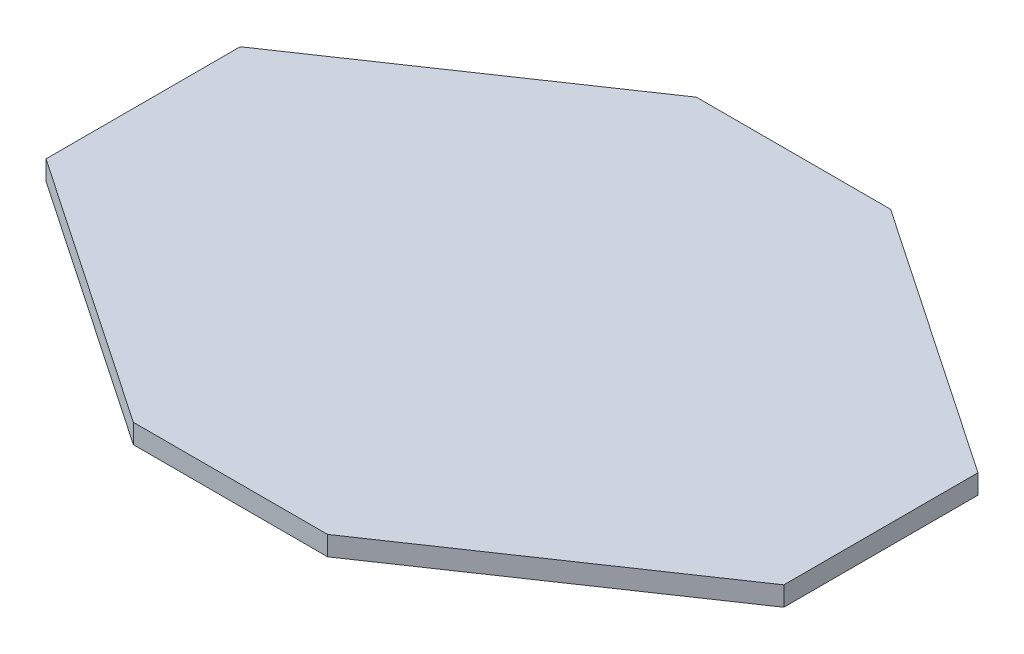
ISO-10303-21;
HEADER;
FILE_DESCRIPTION(('STEP AP214'),'2;1');
FILE_NAME('part.step','',(''),(''),'','','');
FILE_SCHEMA(('AUTOMOTIVE_DESIGN { 1 0 10303 214 1 1 1 1 }'));
ENDSEC;
DATA;
#1=APPLICATION_CONTEXT('core data for automotive mechanical design processes');
#2=APPLICATION_PROTOCOL_DEFINITION('international standard','automotive_design',2000,#1);
#3=PRODUCT_CONTEXT('',#1,'mechanical');
#4=PRODUCT('Part','Part','',(#3));
#5=PRODUCT_RELATED_PRODUCT_CATEGORY('part','',(#4));
#6=PRODUCT_DEFINITION_FORMATION('','',#4);
#7=PRODUCT_DEFINITION_CONTEXT('part definition',#1,'design');
#8=PRODUCT_DEFINITION('design','',#6,#7);
#9=PRODUCT_DEFINITION_SHAPE('','',#8);
#10=(LENGTH_UNIT() NAMED_UNIT(*) SI_UNIT(.MILLI.,.METRE.));
#11=(NAMED_UNIT(*) PLANE_ANGLE_UNIT() SI_UNIT($,.RADIAN.));
#12=(NAMED_UNIT(*) SI_UNIT($,.STERADIAN.) SOLID_ANGLE_UNIT());
#13=UNCERTAINTY_MEASURE_WITH_UNIT(LENGTH_MEASURE(1.E-05),#10,'distance_accuracy_value','');
#14=(GEOMETRIC_REPRESENTATION_CONTEXT(3) GLOBAL_UNCERTAINTY_ASSIGNED_CONTEXT((#13)) GLOBAL_UNIT_ASSIGNED_CONTEXT((#10,
#11,#12)) REPRESENTATION_CONTEXT('',''));
#15=CARTESIAN_POINT('',(0.,0.,0.));
#16=DIRECTION('',(0.,0.,1.));
#17=DIRECTION('',(1.,0.,0.));
#18=AXIS2_PLACEMENT_3D('',#15,#16,#17);
#19=CARTESIAN_POINT('',(-76.6431891257823,10.,51.4013333989402));
#20=DIRECTION('',(1.,0.,0.));
#21=DIRECTION('',(0.,0.,-1.));
#22=AXIS2_PLACEMENT_3D('',#19,#20,#21);
#23=PLANE('',#22);
#24=DIRECTION('',(0.,0.,1.));
#25=VECTOR('',#24,1.);
#26=CARTESIAN_POINT('',(-76.6431891257823,0.,51.4013333989402));
#27=LINE('',#26,#25);
#28=CARTESIAN_POINT('',(-76.6431891257823,0.,51.4013333989402));
#29=VERTEX_POINT('',#28);
#30=CARTESIAN_POINT('',(-76.6431891257823,0.,151.40133339894));
#31=VERTEX_POINT('',#30);
#32=EDGE_CURVE('E129',#29,#31,#27,.T.);
#33=ORIENTED_EDGE('',*,*,#32,.T.);
#34=DIRECTION('',(0.,-1.,0.));
#35=VECTOR('',#34,1.);
#36=CARTESIAN_POINT('',(-76.6431891257823,10.,151.40133339894));
#37=LINE('',#36,#35);
#38=CARTESIAN_POINT('',(-76.6431891257823,10.,151.40133339894));
#39=VERTEX_POINT('',#38);
#40=EDGE_CURVE('E11',#39,#31,#37,.T.);
#41=ORIENTED_EDGE('',*,*,#40,.F.);
#42=DIRECTION('',(0.,0.,1.));
#43=VECTOR('',#42,1.);
#44=CARTESIAN_POINT('',(-76.6431891257823,10.,51.4013333989402));
#45=LINE('',#44,#43);
#46=CARTESIAN_POINT('',(-76.6431891257823,10.,51.4013333989402));
#47=VERTEX_POINT('',#46);
#48=EDGE_CURVE('E147',#47,#39,#45,.T.);
#49=ORIENTED_EDGE('',*,*,#48,.F.);
#50=DIRECTION('',(0.,-1.,0.));
#51=VECTOR('',#50,1.);
#52=CARTESIAN_POINT('',(-76.6431891257823,10.,51.4013333989402));
#53=LINE('',#52,#51);
#54=EDGE_CURVE('E49',#47,#29,#53,.T.);
#55=ORIENTED_EDGE('',*,*,#54,.T.);
#56=EDGE_LOOP('',(#33,#41,#49,#55));
#57=FACE_BOUND('',#56,.T.);
#58=ADVANCED_FACE('F33',(#57),#23,.F.);
#59=CARTESIAN_POINT('',(-76.6431891257823,10.,151.40133339894));
#60=DIRECTION('',(0.561501418337265,0.,-0.827475774391758));
#61=DIRECTION('',(-0.827475774391758,0.,-0.561501418337265));
#62=AXIS2_PLACEMENT_3D('',#59,#60,#61);
#63=PLANE('',#62);
#64=DIRECTION('',(0.827475774391758,0.,0.561501418337265));
#65=VECTOR('',#64,1.);
#66=CARTESIAN_POINT('',(-76.6431891257823,0.,151.40133339894));
#67=LINE('',#66,#65);
#68=CARTESIAN_POINT('',(63.3568108742177,0.,246.40133339894));
#69=VERTEX_POINT('',#68);
#70=EDGE_CURVE('E131',#31,#69,#67,.T.);
#71=ORIENTED_EDGE('',*,*,#70,.T.);
#72=DIRECTION('',(0.,-1.,0.));
#73=VECTOR('',#72,1.);
#74=CARTESIAN_POINT('',(63.3568108742177,10.,246.40133339894));
#75=LINE('',#74,#73);
#76=CARTESIAN_POINT('',(63.3568108742177,10.,246.40133339894));
#77=VERTEX_POINT('',#76);
#78=EDGE_CURVE('E41',#77,#69,#75,.T.);
#79=ORIENTED_EDGE('',*,*,#78,.F.);
#80=DIRECTION('',(0.827475774391758,0.,0.561501418337265));
#81=VECTOR('',#80,1.);
#82=CARTESIAN_POINT('',(-76.6431891257823,10.,151.40133339894));
#83=LINE('',#82,#81);
#84=EDGE_CURVE('E87',#39,#77,#83,.T.);
#85=ORIENTED_EDGE('',*,*,#84,.F.);
#86=ORIENTED_EDGE('',*,*,#40,.T.);
#87=EDGE_LOOP('',(#71,#79,#85,#86));
#88=FACE_BOUND('',#87,.T.);
#89=ADVANCED_FACE('F176',(#88),#63,.F.);
#90=CARTESIAN_POINT('',(63.3568108742177,10.,246.40133339894));
#91=DIRECTION('',(0.,0.,-1.));
#92=DIRECTION('',(-1.,0.,0.));
#93=AXIS2_PLACEMENT_3D('',#90,#91,#92);
#94=PLANE('',#93);
#95=DIRECTION('',(1.,0.,0.));
#96=VECTOR('',#95,1.);
#97=CARTESIAN_POINT('',(63.3568108742177,0.,246.40133339894));
#98=LINE('',#97,#96);
#99=CARTESIAN_POINT('',(163.356810874218,0.,246.40133339894));
#100=VERTEX_POINT('',#99);
#101=EDGE_CURVE('E133',#69,#100,#98,.T.);
#102=ORIENTED_EDGE('',*,*,#101,.T.);
#103=DIRECTION('',(0.,-1.,0.));
#104=VECTOR('',#103,1.);
#105=CARTESIAN_POINT('',(163.356810874218,10.,246.40133339894));
#106=LINE('',#105,#104);
#107=CARTESIAN_POINT('',(163.356810874218,10.,246.40133339894));
#108=VERTEX_POINT('',#107);
#109=EDGE_CURVE('E153',#108,#100,#106,.T.);
#110=ORIENTED_EDGE('',*,*,#109,.F.);
#111=DIRECTION('',(1.,0.,0.));
#112=VECTOR('',#111,1.);
#113=CARTESIAN_POINT('',(63.3568108742177,10.,246.40133339894));
#114=LINE('',#113,#112);
#115=EDGE_CURVE('E161',#77,#108,#114,.T.);
#116=ORIENTED_EDGE('',*,*,#115,.F.);
#117=ORIENTED_EDGE('',*,*,#78,.T.);
#118=EDGE_LOOP('',(#102,#110,#116,#117));
#119=FACE_BOUND('',#118,.T.);
#120=ADVANCED_FACE('F159',(#119),#94,.F.);
#121=CARTESIAN_POINT('',(163.356810874218,10.,246.40133339894));
#122=DIRECTION('',(-0.561501418337265,0.,-0.827475774391758));
#123=DIRECTION('',(-0.827475774391758,0.,0.561501418337265));
#124=AXIS2_PLACEMENT_3D('',#121,#122,#123);
#125=PLANE('',#124);
#126=DIRECTION('',(0.827475774391758,0.,-0.561501418337265));
#127=VECTOR('',#126,1.);
#128=CARTESIAN_POINT('',(163.356810874218,0.,246.40133339894));
#129=LINE('',#128,#127);
#130=CARTESIAN_POINT('',(303.356810874218,0.,151.40133339894));
#131=VERTEX_POINT('',#130);
#132=EDGE_CURVE('E135',#100,#131,#129,.T.);
#133=ORIENTED_EDGE('',*,*,#132,.T.);
#134=DIRECTION('',(0.,-1.,0.));
#135=VECTOR('',#134,1.);
#136=CARTESIAN_POINT('',(303.356810874218,10.,151.40133339894));
#137=LINE('',#136,#135);
#138=CARTESIAN_POINT('',(303.356810874218,10.,151.40133339894));
#139=VERTEX_POINT('',#138);
#140=EDGE_CURVE('E151',#139,#131,#137,.T.);
#141=ORIENTED_EDGE('',*,*,#140,.F.);
#142=DIRECTION('',(0.827475774391758,0.,-0.561501418337265));
#143=VECTOR('',#142,1.);
#144=CARTESIAN_POINT('',(163.356810874218,10.,246.40133339894));
#145=LINE('',#144,#143);
#146=EDGE_CURVE('E170',#108,#139,#145,.T.);
#147=ORIENTED_EDGE('',*,*,#146,.F.);
#148=ORIENTED_EDGE('',*,*,#109,.T.);
#149=EDGE_LOOP('',(#133,#141,#147,#148));
#150=FACE_BOUND('',#149,.T.);
#151=ADVANCED_FACE('F168',(#150),#125,.F.);
#152=CARTESIAN_POINT('',(303.356810874218,10.,51.4013333989402));
#153=DIRECTION('',(1.,0.,0.));
#154=DIRECTION('',(0.,0.,-1.));
#155=AXIS2_PLACEMENT_3D('',#152,#153,#154);
#156=PLANE('',#155);
#157=DIRECTION('',(0.,0.,1.));
#158=VECTOR('',#157,1.);
#159=CARTESIAN_POINT('',(303.356810874218,0.,51.4013333989402));
#160=LINE('',#159,#158);
#161=CARTESIAN_POINT('',(303.356810874218,0.,51.4013333989402));
#162=VERTEX_POINT('',#161);
#163=EDGE_CURVE('E138',#162,#131,#160,.T.);
#164=ORIENTED_EDGE('',*,*,#163,.F.);
#165=DIRECTION('',(0.,-1.,0.));
#166=VECTOR('',#165,1.);
#167=CARTESIAN_POINT('',(303.356810874218,10.,51.4013333989402));
#168=LINE('',#167,#166);
#169=CARTESIAN_POINT('',(303.356810874218,10.,51.4013333989402));
#170=VERTEX_POINT('',#169);
#171=EDGE_CURVE('E112',#170,#162,#168,.T.);
#172=ORIENTED_EDGE('',*,*,#171,.F.);
#173=DIRECTION('',(0.,0.,1.));
#174=VECTOR('',#173,1.);
#175=CARTESIAN_POINT('',(303.356810874218,10.,51.4013333989402));
#176=LINE('',#175,#174);
#177=EDGE_CURVE('E121',#170,#139,#176,.T.);
#178=ORIENTED_EDGE('',*,*,#177,.T.);
#179=ORIENTED_EDGE('',*,*,#140,.T.);
#180=EDGE_LOOP('',(#164,#172,#178,#179));
#181=FACE_BOUND('',#180,.T.);
#182=ADVANCED_FACE('F186',(#181),#156,.T.);
#183=CARTESIAN_POINT('',(163.356810874218,10.,-43.5986666010598));
#184=DIRECTION('',(0.561501418337265,0.,-0.827475774391758));
#185=DIRECTION('',(-0.827475774391758,0.,-0.561501418337265));
#186=AXIS2_PLACEMENT_3D('',#183,#184,#185);
#187=PLANE('',#186);
#188=DIRECTION('',(0.827475774391758,0.,0.561501418337265));
#189=VECTOR('',#188,1.);
#190=CARTESIAN_POINT('',(163.356810874218,0.,-43.5986666010598));
#191=LINE('',#190,#189);
#192=CARTESIAN_POINT('',(163.356810874218,0.,-43.5986666010598));
#193=VERTEX_POINT('',#192);
#194=EDGE_CURVE('E108',#193,#162,#191,.T.);
#195=ORIENTED_EDGE('',*,*,#194,.F.);
#196=DIRECTION('',(0.,-1.,0.));
#197=VECTOR('',#196,1.);
#198=CARTESIAN_POINT('',(163.356810874218,10.,-43.5986666010598));
#199=LINE('',#198,#197);
#200=CARTESIAN_POINT('',(163.356810874218,10.,-43.5986666010598));
#201=VERTEX_POINT('',#200);
#202=EDGE_CURVE('E103',#201,#193,#199,.T.);
#203=ORIENTED_EDGE('',*,*,#202,.F.);
#204=DIRECTION('',(0.827475774391758,0.,0.561501418337265));
#205=VECTOR('',#204,1.);
#206=CARTESIAN_POINT('',(163.356810874218,10.,-43.5986666010598));
#207=LINE('',#206,#205);
#208=EDGE_CURVE('E106',#201,#170,#207,.T.);
#209=ORIENTED_EDGE('',*,*,#208,.T.);
#210=ORIENTED_EDGE('',*,*,#171,.T.);
#211=EDGE_LOOP('',(#195,#203,#209,#210));
#212=FACE_BOUND('',#211,.T.);
#213=ADVANCED_FACE('F105',(#212),#187,.T.);
#214=CARTESIAN_POINT('',(63.3568108742177,10.,-43.5986666010598));
#215=DIRECTION('',(0.,0.,-1.));
#216=DIRECTION('',(-1.,0.,0.));
#217=AXIS2_PLACEMENT_3D('',#214,#215,#216);
#218=PLANE('',#217);
#219=DIRECTION('',(1.,0.,0.));
#220=VECTOR('',#219,1.);
#221=CARTESIAN_POINT('',(63.3568108742177,0.,-43.5986666010598));
#222=LINE('',#221,#220);
#223=CARTESIAN_POINT('',(63.3568108742177,0.,-43.5986666010598));
#224=VERTEX_POINT('',#223);
#225=EDGE_CURVE('E142',#224,#193,#222,.T.);
#226=ORIENTED_EDGE('',*,*,#225,.F.);
#227=DIRECTION('',(0.,-1.,0.));
#228=VECTOR('',#227,1.);
#229=CARTESIAN_POINT('',(63.3568108742177,10.,-43.5986666010598));
#230=LINE('',#229,#228);
#231=CARTESIAN_POINT('',(63.3568108742177,10.,-43.5986666010598));
#232=VERTEX_POINT('',#231);
#233=EDGE_CURVE('E75',#232,#224,#230,.T.);
#234=ORIENTED_EDGE('',*,*,#233,.F.);
#235=DIRECTION('',(1.,0.,0.));
#236=VECTOR('',#235,1.);
#237=CARTESIAN_POINT('',(63.3568108742177,10.,-43.5986666010598));
#238=LINE('',#237,#236);
#239=EDGE_CURVE('E119',#232,#201,#238,.T.);
#240=ORIENTED_EDGE('',*,*,#239,.T.);
#241=ORIENTED_EDGE('',*,*,#202,.T.);
#242=EDGE_LOOP('',(#226,#234,#240,#241));
#243=FACE_BOUND('',#242,.T.);
#244=ADVANCED_FACE('F123',(#243),#218,.T.);
#245=CARTESIAN_POINT('',(-76.6431891257823,10.,51.4013333989402));
#246=DIRECTION('',(-0.561501418337265,0.,-0.827475774391758));
#247=DIRECTION('',(-0.827475774391758,0.,0.561501418337265));
#248=AXIS2_PLACEMENT_3D('',#245,#246,#247);
#249=PLANE('',#248);
#250=DIRECTION('',(0.827475774391758,0.,-0.561501418337265));
#251=VECTOR('',#250,1.);
#252=CARTESIAN_POINT('',(-76.6431891257823,0.,51.4013333989402));
#253=LINE('',#252,#251);
#254=EDGE_CURVE('E144',#29,#224,#253,.T.);
#255=ORIENTED_EDGE('',*,*,#254,.F.);
#256=ORIENTED_EDGE('',*,*,#54,.F.);
#257=DIRECTION('',(0.827475774391758,0.,-0.561501418337265));
#258=VECTOR('',#257,1.);
#259=CARTESIAN_POINT('',(-76.6431891257823,10.,51.4013333989402));
#260=LINE('',#259,#258);
#261=EDGE_CURVE('E124',#47,#232,#260,.T.);
#262=ORIENTED_EDGE('',*,*,#261,.T.);
#263=ORIENTED_EDGE('',*,*,#233,.T.);
#264=EDGE_LOOP('',(#255,#256,#262,#263));
#265=FACE_BOUND('',#264,.T.);
#266=ADVANCED_FACE('F194',(#265),#249,.T.);
#267=CARTESIAN_POINT('',(0.,10.,0.));
#268=DIRECTION('',(0.,1.,0.));
#269=DIRECTION('',(0.,0.,1.));
#270=AXIS2_PLACEMENT_3D('',#267,#268,#269);
#271=PLANE('',#270);
#272=ORIENTED_EDGE('',*,*,#48,.T.);
#273=ORIENTED_EDGE('',*,*,#84,.T.);
#274=ORIENTED_EDGE('',*,*,#115,.T.);
#275=ORIENTED_EDGE('',*,*,#146,.T.);
#276=ORIENTED_EDGE('',*,*,#177,.F.);
#277=ORIENTED_EDGE('',*,*,#208,.F.);
#278=ORIENTED_EDGE('',*,*,#239,.F.);
#279=ORIENTED_EDGE('',*,*,#261,.F.);
#280=EDGE_LOOP('',(#272,#273,#274,#275,#276,#277,#278,#279));
#281=FACE_BOUND('',#280,.T.);
#282=ADVANCED_FACE('F117',(#281),#271,.T.);
#283=CARTESIAN_POINT('',(0.,0.,0.));
#284=DIRECTION('',(0.,1.,0.));
#285=DIRECTION('',(0.,0.,1.));
#286=AXIS2_PLACEMENT_3D('',#283,#284,#285);
#287=PLANE('',#286);
#288=ORIENTED_EDGE('',*,*,#32,.F.);
#289=ORIENTED_EDGE('',*,*,#254,.T.);
#290=ORIENTED_EDGE('',*,*,#225,.T.);
#291=ORIENTED_EDGE('',*,*,#194,.T.);
#292=ORIENTED_EDGE('',*,*,#163,.T.);
#293=ORIENTED_EDGE('',*,*,#132,.F.);
#294=ORIENTED_EDGE('',*,*,#101,.F.);
#295=ORIENTED_EDGE('',*,*,#70,.F.);
#296=EDGE_LOOP('',(#288,#289,#290,#291,#292,#293,#294,#295));
#297=FACE_BOUND('',#296,.T.);
#298=ADVANCED_FACE('F164',(#297),#287,.F.);
#299=CLOSED_SHELL('',(#58,#89,#120,#151,#182,#213,#244,#266,#282,#298));
#300=MANIFOLD_SOLID_BREP('B2',#299);
#301=ADVANCED_BREP_SHAPE_REPRESENTATION('',(#18,#300),#14);
#302=SHAPE_DEFINITION_REPRESENTATION(#9,#301);
ENDSEC;
END-ISO-10303-21;
